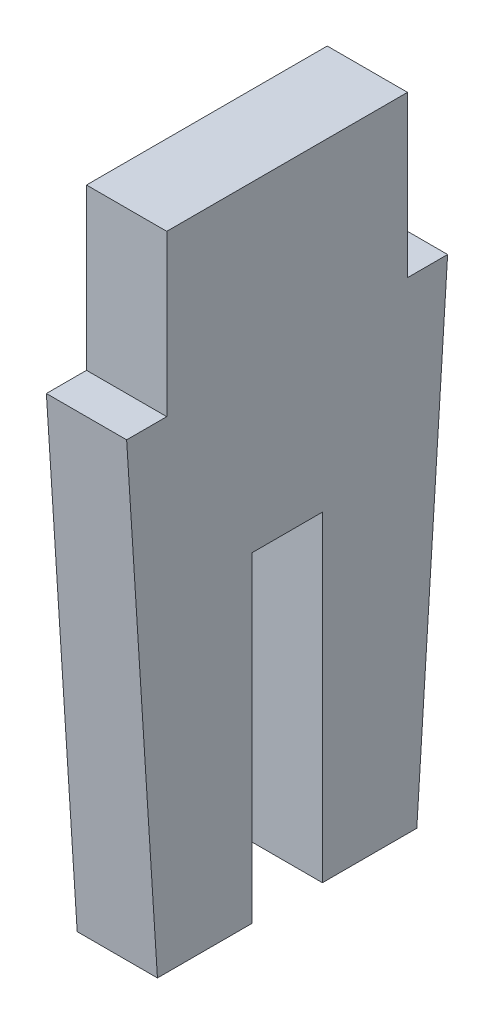
ISO-10303-21;
HEADER;
FILE_DESCRIPTION(('STEP AP214'),'2;1');
FILE_NAME('part.step','',(''),(''),'','','');
FILE_SCHEMA(('AUTOMOTIVE_DESIGN { 1 0 10303 214 1 1 1 1 }'));
ENDSEC;
DATA;
#1=APPLICATION_CONTEXT('core data for automotive mechanical design processes');
#2=APPLICATION_PROTOCOL_DEFINITION('international standard','automotive_design',2000,#1);
#3=PRODUCT_CONTEXT('',#1,'mechanical');
#4=PRODUCT('Part','Part','',(#3));
#5=PRODUCT_RELATED_PRODUCT_CATEGORY('part','',(#4));
#6=PRODUCT_DEFINITION_FORMATION('','',#4);
#7=PRODUCT_DEFINITION_CONTEXT('part definition',#1,'design');
#8=PRODUCT_DEFINITION('design','',#6,#7);
#9=PRODUCT_DEFINITION_SHAPE('','',#8);
#10=(LENGTH_UNIT() NAMED_UNIT(*) SI_UNIT(.MILLI.,.METRE.));
#11=(NAMED_UNIT(*) PLANE_ANGLE_UNIT() SI_UNIT($,.RADIAN.));
#12=(NAMED_UNIT(*) SI_UNIT($,.STERADIAN.) SOLID_ANGLE_UNIT());
#13=UNCERTAINTY_MEASURE_WITH_UNIT(LENGTH_MEASURE(1.E-05),#10,'distance_accuracy_value','');
#14=(GEOMETRIC_REPRESENTATION_CONTEXT(3) GLOBAL_UNCERTAINTY_ASSIGNED_CONTEXT((#13)) GLOBAL_UNIT_ASSIGNED_CONTEXT((#10,
#11,#12)) REPRESENTATION_CONTEXT('',''));
#15=CARTESIAN_POINT('',(0.,0.,0.));
#16=DIRECTION('',(0.,0.,1.));
#17=DIRECTION('',(1.,0.,0.));
#18=AXIS2_PLACEMENT_3D('',#15,#16,#17);
#19=CARTESIAN_POINT('',(6.35,50.8,0.));
#20=DIRECTION('',(0.,0.,-1.));
#21=DIRECTION('',(0.,1.,0.));
#22=AXIS2_PLACEMENT_3D('',#19,#20,#21);
#23=PLANE('',#22);
#24=DIRECTION('',(0.,-1.,0.));
#25=VECTOR('',#24,1.);
#26=CARTESIAN_POINT('',(0.,50.8,0.));
#27=LINE('',#26,#25);
#28=CARTESIAN_POINT('',(0.,50.8,0.));
#29=VERTEX_POINT('',#28);
#30=CARTESIAN_POINT('',(0.,38.1,0.));
#31=VERTEX_POINT('',#30);
#32=EDGE_CURVE('E153',#29,#31,#27,.T.);
#33=ORIENTED_EDGE('',*,*,#32,.T.);
#34=DIRECTION('',(-1.,0.,0.));
#35=VECTOR('',#34,1.);
#36=CARTESIAN_POINT('',(6.35,38.1,0.));
#37=LINE('',#36,#35);
#38=CARTESIAN_POINT('',(6.35,38.1,0.));
#39=VERTEX_POINT('',#38);
#40=EDGE_CURVE('E11',#39,#31,#37,.T.);
#41=ORIENTED_EDGE('',*,*,#40,.F.);
#42=DIRECTION('',(0.,-1.,0.));
#43=VECTOR('',#42,1.);
#44=CARTESIAN_POINT('',(6.35,50.8,0.));
#45=LINE('',#44,#43);
#46=CARTESIAN_POINT('',(6.35,50.8,0.));
#47=VERTEX_POINT('',#46);
#48=EDGE_CURVE('E177',#47,#39,#45,.T.);
#49=ORIENTED_EDGE('',*,*,#48,.F.);
#50=DIRECTION('',(-1.,0.,0.));
#51=VECTOR('',#50,1.);
#52=CARTESIAN_POINT('',(6.35,50.8,0.));
#53=LINE('',#52,#51);
#54=EDGE_CURVE('E149',#47,#29,#53,.T.);
#55=ORIENTED_EDGE('',*,*,#54,.T.);
#56=EDGE_LOOP('',(#33,#41,#49,#55));
#57=FACE_BOUND('',#56,.T.);
#58=ADVANCED_FACE('F33',(#57),#23,.F.);
#59=CARTESIAN_POINT('',(6.35,38.1,0.));
#60=DIRECTION('',(0.,-1.,0.));
#61=DIRECTION('',(0.,0.,-1.));
#62=AXIS2_PLACEMENT_3D('',#59,#60,#61);
#63=PLANE('',#62);
#64=DIRECTION('',(0.,0.,1.));
#65=VECTOR('',#64,1.);
#66=CARTESIAN_POINT('',(0.,38.1,0.));
#67=LINE('',#66,#65);
#68=CARTESIAN_POINT('',(0.,38.1,3.175));
#69=VERTEX_POINT('',#68);
#70=EDGE_CURVE('E156',#31,#69,#67,.T.);
#71=ORIENTED_EDGE('',*,*,#70,.T.);
#72=DIRECTION('',(-1.,0.,0.));
#73=VECTOR('',#72,1.);
#74=CARTESIAN_POINT('',(6.35,38.1,3.175));
#75=LINE('',#74,#73);
#76=CARTESIAN_POINT('',(6.35,38.1,3.175));
#77=VERTEX_POINT('',#76);
#78=EDGE_CURVE('E41',#77,#69,#75,.T.);
#79=ORIENTED_EDGE('',*,*,#78,.F.);
#80=DIRECTION('',(0.,0.,1.));
#81=VECTOR('',#80,1.);
#82=CARTESIAN_POINT('',(6.35,38.1,0.));
#83=LINE('',#82,#81);
#84=EDGE_CURVE('E104',#39,#77,#83,.T.);
#85=ORIENTED_EDGE('',*,*,#84,.F.);
#86=ORIENTED_EDGE('',*,*,#40,.T.);
#87=EDGE_LOOP('',(#71,#79,#85,#86));
#88=FACE_BOUND('',#87,.T.);
#89=ADVANCED_FACE('F204',(#88),#63,.F.);
#90=CARTESIAN_POINT('',(6.35,6.35,1.143));
#91=DIRECTION('',(0.,0.0638693292837024,-0.997958270057847));
#92=DIRECTION('',(0.,0.997958270057847,0.0638693292837024));
#93=AXIS2_PLACEMENT_3D('',#90,#91,#92);
#94=PLANE('',#93);
#95=DIRECTION('',(0.,-0.997958270057847,-0.0638693292837024));
#96=VECTOR('',#95,1.);
#97=CARTESIAN_POINT('',(0.,6.35,1.143));
#98=LINE('',#97,#96);
#99=CARTESIAN_POINT('',(0.,0.,0.736599999999994));
#100=VERTEX_POINT('',#99);
#101=EDGE_CURVE('E159',#69,#100,#98,.T.);
#102=ORIENTED_EDGE('',*,*,#101,.T.);
#103=DIRECTION('',(-1.,0.,0.));
#104=VECTOR('',#103,1.);
#105=CARTESIAN_POINT('',(6.35,0.,0.736599999999994));
#106=LINE('',#105,#104);
#107=CARTESIAN_POINT('',(6.35,0.,0.736599999999994));
#108=VERTEX_POINT('',#107);
#109=EDGE_CURVE('E196',#108,#100,#106,.T.);
#110=ORIENTED_EDGE('',*,*,#109,.F.);
#111=DIRECTION('',(0.,-0.997958270057847,-0.0638693292837023));
#112=VECTOR('',#111,1.);
#113=CARTESIAN_POINT('',(6.35,38.1,3.175));
#114=LINE('',#113,#112);
#115=EDGE_CURVE('E203',#77,#108,#114,.T.);
#116=ORIENTED_EDGE('',*,*,#115,.F.);
#117=ORIENTED_EDGE('',*,*,#78,.T.);
#118=EDGE_LOOP('',(#102,#110,#116,#117));
#119=FACE_BOUND('',#118,.T.);
#120=ADVANCED_FACE('F201',(#119),#94,.F.);
#121=CARTESIAN_POINT('',(6.35,0.,0.736599999999994));
#122=DIRECTION('',(0.,1.,0.));
#123=DIRECTION('',(0.,0.,1.));
#124=AXIS2_PLACEMENT_3D('',#121,#122,#123);
#125=PLANE('',#124);
#126=DIRECTION('',(0.,0.,-1.));
#127=VECTOR('',#126,1.);
#128=CARTESIAN_POINT('',(0.,0.,0.736599999999994));
#129=LINE('',#128,#127);
#130=CARTESIAN_POINT('',(0.,0.,-6.731));
#131=VERTEX_POINT('',#130);
#132=EDGE_CURVE('E161',#100,#131,#129,.T.);
#133=ORIENTED_EDGE('',*,*,#132,.T.);
#134=DIRECTION('',(-1.,0.,0.));
#135=VECTOR('',#134,1.);
#136=CARTESIAN_POINT('',(6.35,0.,-6.731));
#137=LINE('',#136,#135);
#138=CARTESIAN_POINT('',(6.35,0.,-6.731));
#139=VERTEX_POINT('',#138);
#140=EDGE_CURVE('E193',#139,#131,#137,.T.);
#141=ORIENTED_EDGE('',*,*,#140,.F.);
#142=DIRECTION('',(0.,0.,-1.));
#143=VECTOR('',#142,1.);
#144=CARTESIAN_POINT('',(6.35,0.,0.736599999999994));
#145=LINE('',#144,#143);
#146=EDGE_CURVE('E223',#108,#139,#145,.T.);
#147=ORIENTED_EDGE('',*,*,#146,.F.);
#148=ORIENTED_EDGE('',*,*,#109,.T.);
#149=EDGE_LOOP('',(#133,#141,#147,#148));
#150=FACE_BOUND('',#149,.T.);
#151=ADVANCED_FACE('F214',(#150),#125,.F.);
#152=CARTESIAN_POINT('',(6.35,25.4,-6.731));
#153=DIRECTION('',(0.,0.,1.));
#154=DIRECTION('',(0.,-1.,0.));
#155=AXIS2_PLACEMENT_3D('',#152,#153,#154);
#156=PLANE('',#155);
#157=DIRECTION('',(0.,1.,0.));
#158=VECTOR('',#157,1.);
#159=CARTESIAN_POINT('',(0.,25.4,-6.731));
#160=LINE('',#159,#158);
#161=CARTESIAN_POINT('',(0.,25.4,-6.731));
#162=VERTEX_POINT('',#161);
#163=EDGE_CURVE('E163',#131,#162,#160,.T.);
#164=ORIENTED_EDGE('',*,*,#163,.T.);
#165=DIRECTION('',(-1.,0.,0.));
#166=VECTOR('',#165,1.);
#167=CARTESIAN_POINT('',(6.35,25.4,-6.731));
#168=LINE('',#167,#166);
#169=CARTESIAN_POINT('',(6.35,25.4,-6.731));
#170=VERTEX_POINT('',#169);
#171=EDGE_CURVE('E190',#170,#162,#168,.T.);
#172=ORIENTED_EDGE('',*,*,#171,.F.);
#173=DIRECTION('',(0.,1.,0.));
#174=VECTOR('',#173,1.);
#175=CARTESIAN_POINT('',(6.35,25.4,-6.731));
#176=LINE('',#175,#174);
#177=EDGE_CURVE('E220',#139,#170,#176,.T.);
#178=ORIENTED_EDGE('',*,*,#177,.F.);
#179=ORIENTED_EDGE('',*,*,#140,.T.);
#180=EDGE_LOOP('',(#164,#172,#178,#179));
#181=FACE_BOUND('',#180,.T.);
#182=ADVANCED_FACE('F218',(#181),#156,.F.);
#183=CARTESIAN_POINT('',(6.35,25.4,-12.319));
#184=DIRECTION('',(0.,1.,0.));
#185=DIRECTION('',(0.,0.,1.));
#186=AXIS2_PLACEMENT_3D('',#183,#184,#185);
#187=PLANE('',#186);
#188=DIRECTION('',(0.,0.,-1.));
#189=VECTOR('',#188,1.);
#190=CARTESIAN_POINT('',(0.,25.4,-12.319));
#191=LINE('',#190,#189);
#192=CARTESIAN_POINT('',(0.,25.4,-12.319));
#193=VERTEX_POINT('',#192);
#194=EDGE_CURVE('E165',#162,#193,#191,.T.);
#195=ORIENTED_EDGE('',*,*,#194,.T.);
#196=DIRECTION('',(-1.,0.,0.));
#197=VECTOR('',#196,1.);
#198=CARTESIAN_POINT('',(6.35,25.4,-12.319));
#199=LINE('',#198,#197);
#200=CARTESIAN_POINT('',(6.35,25.4,-12.319));
#201=VERTEX_POINT('',#200);
#202=EDGE_CURVE('E187',#201,#193,#199,.T.);
#203=ORIENTED_EDGE('',*,*,#202,.F.);
#204=DIRECTION('',(0.,0.,-1.));
#205=VECTOR('',#204,1.);
#206=CARTESIAN_POINT('',(6.35,25.4,-12.319));
#207=LINE('',#206,#205);
#208=EDGE_CURVE('E222',#170,#201,#207,.T.);
#209=ORIENTED_EDGE('',*,*,#208,.F.);
#210=ORIENTED_EDGE('',*,*,#171,.T.);
#211=EDGE_LOOP('',(#195,#203,#209,#210));
#212=FACE_BOUND('',#211,.T.);
#213=ADVANCED_FACE('F246',(#212),#187,.F.);
#214=CARTESIAN_POINT('',(6.35,25.4,-12.319));
#215=DIRECTION('',(0.,0.,-1.));
#216=DIRECTION('',(0.,1.,0.));
#217=AXIS2_PLACEMENT_3D('',#214,#215,#216);
#218=PLANE('',#217);
#219=DIRECTION('',(0.,-1.,0.));
#220=VECTOR('',#219,1.);
#221=CARTESIAN_POINT('',(0.,25.4,-12.319));
#222=LINE('',#221,#220);
#223=CARTESIAN_POINT('',(0.,0.,-12.319));
#224=VERTEX_POINT('',#223);
#225=EDGE_CURVE('E167',#193,#224,#222,.T.);
#226=ORIENTED_EDGE('',*,*,#225,.T.);
#227=DIRECTION('',(-1.,0.,0.));
#228=VECTOR('',#227,1.);
#229=CARTESIAN_POINT('',(6.35,0.,-12.319));
#230=LINE('',#229,#228);
#231=CARTESIAN_POINT('',(6.35,0.,-12.319));
#232=VERTEX_POINT('',#231);
#233=EDGE_CURVE('E184',#232,#224,#230,.T.);
#234=ORIENTED_EDGE('',*,*,#233,.F.);
#235=DIRECTION('',(0.,-1.,0.));
#236=VECTOR('',#235,1.);
#237=CARTESIAN_POINT('',(6.35,25.4,-12.319));
#238=LINE('',#237,#236);
#239=EDGE_CURVE('E225',#201,#232,#238,.T.);
#240=ORIENTED_EDGE('',*,*,#239,.F.);
#241=ORIENTED_EDGE('',*,*,#202,.T.);
#242=EDGE_LOOP('',(#226,#234,#240,#241));
#243=FACE_BOUND('',#242,.T.);
#244=ADVANCED_FACE('F243',(#243),#218,.F.);
#245=CARTESIAN_POINT('',(6.35,0.,-12.319));
#246=DIRECTION('',(0.,1.,0.));
#247=DIRECTION('',(0.,0.,1.));
#248=AXIS2_PLACEMENT_3D('',#245,#246,#247);
#249=PLANE('',#248);
#250=DIRECTION('',(0.,0.,-1.));
#251=VECTOR('',#250,1.);
#252=CARTESIAN_POINT('',(0.,0.,-12.319));
#253=LINE('',#252,#251);
#254=CARTESIAN_POINT('',(0.,0.,-19.7866));
#255=VERTEX_POINT('',#254);
#256=EDGE_CURVE('E169',#224,#255,#253,.T.);
#257=ORIENTED_EDGE('',*,*,#256,.T.);
#258=DIRECTION('',(-1.,0.,0.));
#259=VECTOR('',#258,1.);
#260=CARTESIAN_POINT('',(6.35,0.,-19.7866));
#261=LINE('',#260,#259);
#262=CARTESIAN_POINT('',(6.35,0.,-19.7866));
#263=VERTEX_POINT('',#262);
#264=EDGE_CURVE('E181',#263,#255,#261,.T.);
#265=ORIENTED_EDGE('',*,*,#264,.F.);
#266=DIRECTION('',(0.,0.,-1.));
#267=VECTOR('',#266,1.);
#268=CARTESIAN_POINT('',(6.35,0.,-12.319));
#269=LINE('',#268,#267);
#270=EDGE_CURVE('E231',#232,#263,#269,.T.);
#271=ORIENTED_EDGE('',*,*,#270,.F.);
#272=ORIENTED_EDGE('',*,*,#233,.T.);
#273=EDGE_LOOP('',(#257,#265,#271,#272));
#274=FACE_BOUND('',#273,.T.);
#275=ADVANCED_FACE('F237',(#274),#249,.F.);
#276=CARTESIAN_POINT('',(6.35,38.1,-22.225));
#277=DIRECTION('',(0.,0.0638693292837021,0.997958270057847));
#278=DIRECTION('',(0.,-0.997958270057847,0.0638693292837021));
#279=AXIS2_PLACEMENT_3D('',#276,#277,#278);
#280=PLANE('',#279);
#281=DIRECTION('',(0.,0.997958270057847,-0.0638693292837021));
#282=VECTOR('',#281,1.);
#283=CARTESIAN_POINT('',(0.,38.1,-22.225));
#284=LINE('',#283,#282);
#285=CARTESIAN_POINT('',(0.,38.1,-22.225));
#286=VERTEX_POINT('',#285);
#287=EDGE_CURVE('E172',#255,#286,#284,.T.);
#288=ORIENTED_EDGE('',*,*,#287,.T.);
#289=DIRECTION('',(-1.,0.,0.));
#290=VECTOR('',#289,1.);
#291=CARTESIAN_POINT('',(6.35,38.1,-22.225));
#292=LINE('',#291,#290);
#293=CARTESIAN_POINT('',(6.35,38.1,-22.225));
#294=VERTEX_POINT('',#293);
#295=EDGE_CURVE('E144',#294,#286,#292,.T.);
#296=ORIENTED_EDGE('',*,*,#295,.F.);
#297=DIRECTION('',(0.,0.997958270057847,-0.0638693292837024));
#298=VECTOR('',#297,1.);
#299=CARTESIAN_POINT('',(6.35,6.35,-20.193));
#300=LINE('',#299,#298);
#301=EDGE_CURVE('E135',#263,#294,#300,.T.);
#302=ORIENTED_EDGE('',*,*,#301,.F.);
#303=ORIENTED_EDGE('',*,*,#264,.T.);
#304=EDGE_LOOP('',(#288,#296,#302,#303));
#305=FACE_BOUND('',#304,.T.);
#306=ADVANCED_FACE('F240',(#305),#280,.F.);
#307=CARTESIAN_POINT('',(6.35,38.1,-19.05));
#308=DIRECTION('',(0.,-1.,0.));
#309=DIRECTION('',(0.,0.,-1.));
#310=AXIS2_PLACEMENT_3D('',#307,#308,#309);
#311=PLANE('',#310);
#312=DIRECTION('',(0.,0.,1.));
#313=VECTOR('',#312,1.);
#314=CARTESIAN_POINT('',(0.,38.1,-19.05));
#315=LINE('',#314,#313);
#316=CARTESIAN_POINT('',(0.,38.1,-19.05));
#317=VERTEX_POINT('',#316);
#318=EDGE_CURVE('E143',#286,#317,#315,.T.);
#319=ORIENTED_EDGE('',*,*,#318,.T.);
#320=DIRECTION('',(-1.,0.,0.));
#321=VECTOR('',#320,1.);
#322=CARTESIAN_POINT('',(6.35,38.1,-19.05));
#323=LINE('',#322,#321);
#324=CARTESIAN_POINT('',(6.35,38.1,-19.05));
#325=VERTEX_POINT('',#324);
#326=EDGE_CURVE('E140',#325,#317,#323,.T.);
#327=ORIENTED_EDGE('',*,*,#326,.F.);
#328=DIRECTION('',(0.,0.,1.));
#329=VECTOR('',#328,1.);
#330=CARTESIAN_POINT('',(6.35,38.1,-19.05));
#331=LINE('',#330,#329);
#332=EDGE_CURVE('E129',#294,#325,#331,.T.);
#333=ORIENTED_EDGE('',*,*,#332,.F.);
#334=ORIENTED_EDGE('',*,*,#295,.T.);
#335=EDGE_LOOP('',(#319,#327,#333,#334));
#336=FACE_BOUND('',#335,.T.);
#337=ADVANCED_FACE('F141',(#336),#311,.F.);
#338=CARTESIAN_POINT('',(6.35,50.8,-19.05));
#339=DIRECTION('',(0.,0.,1.));
#340=DIRECTION('',(0.,-1.,0.));
#341=AXIS2_PLACEMENT_3D('',#338,#339,#340);
#342=PLANE('',#341);
#343=DIRECTION('',(0.,1.,0.));
#344=VECTOR('',#343,1.);
#345=CARTESIAN_POINT('',(0.,50.8,-19.05));
#346=LINE('',#345,#344);
#347=CARTESIAN_POINT('',(0.,50.8,-19.05));
#348=VERTEX_POINT('',#347);
#349=EDGE_CURVE('E90',#317,#348,#346,.T.);
#350=ORIENTED_EDGE('',*,*,#349,.T.);
#351=DIRECTION('',(-1.,0.,0.));
#352=VECTOR('',#351,1.);
#353=CARTESIAN_POINT('',(6.35,50.8,-19.05));
#354=LINE('',#353,#352);
#355=CARTESIAN_POINT('',(6.35,50.8,-19.05));
#356=VERTEX_POINT('',#355);
#357=EDGE_CURVE('E145',#356,#348,#354,.T.);
#358=ORIENTED_EDGE('',*,*,#357,.F.);
#359=DIRECTION('',(0.,1.,0.));
#360=VECTOR('',#359,1.);
#361=CARTESIAN_POINT('',(6.35,50.8,-19.05));
#362=LINE('',#361,#360);
#363=EDGE_CURVE('E133',#325,#356,#362,.T.);
#364=ORIENTED_EDGE('',*,*,#363,.F.);
#365=ORIENTED_EDGE('',*,*,#326,.T.);
#366=EDGE_LOOP('',(#350,#358,#364,#365));
#367=FACE_BOUND('',#366,.T.);
#368=ADVANCED_FACE('F147',(#367),#342,.F.);
#369=CARTESIAN_POINT('',(6.35,50.8,0.));
#370=DIRECTION('',(0.,-1.,0.));
#371=DIRECTION('',(0.,0.,-1.));
#372=AXIS2_PLACEMENT_3D('',#369,#370,#371);
#373=PLANE('',#372);
#374=DIRECTION('',(0.,0.,1.));
#375=VECTOR('',#374,1.);
#376=CARTESIAN_POINT('',(0.,50.8,0.));
#377=LINE('',#376,#375);
#378=EDGE_CURVE('E96',#348,#29,#377,.T.);
#379=ORIENTED_EDGE('',*,*,#378,.T.);
#380=ORIENTED_EDGE('',*,*,#54,.F.);
#381=DIRECTION('',(0.,0.,1.));
#382=VECTOR('',#381,1.);
#383=CARTESIAN_POINT('',(6.35,50.8,0.));
#384=LINE('',#383,#382);
#385=EDGE_CURVE('E49',#356,#47,#384,.T.);
#386=ORIENTED_EDGE('',*,*,#385,.F.);
#387=ORIENTED_EDGE('',*,*,#357,.T.);
#388=EDGE_LOOP('',(#379,#380,#386,#387));
#389=FACE_BOUND('',#388,.T.);
#390=ADVANCED_FACE('F261',(#389),#373,.F.);
#391=CARTESIAN_POINT('',(6.35,0.,0.));
#392=DIRECTION('',(-1.,0.,0.));
#393=DIRECTION('',(0.,0.,1.));
#394=AXIS2_PLACEMENT_3D('',#391,#392,#393);
#395=PLANE('',#394);
#396=ORIENTED_EDGE('',*,*,#48,.T.);
#397=ORIENTED_EDGE('',*,*,#84,.T.);
#398=ORIENTED_EDGE('',*,*,#115,.T.);
#399=ORIENTED_EDGE('',*,*,#146,.T.);
#400=ORIENTED_EDGE('',*,*,#177,.T.);
#401=ORIENTED_EDGE('',*,*,#208,.T.);
#402=ORIENTED_EDGE('',*,*,#239,.T.);
#403=ORIENTED_EDGE('',*,*,#270,.T.);
#404=ORIENTED_EDGE('',*,*,#301,.T.);
#405=ORIENTED_EDGE('',*,*,#332,.T.);
#406=ORIENTED_EDGE('',*,*,#363,.T.);
#407=ORIENTED_EDGE('',*,*,#385,.T.);
#408=EDGE_LOOP('',(#396,#397,#398,#399,#400,#401,#402,#403,#404,#405,#406,#407));
#409=FACE_BOUND('',#408,.T.);
#410=ADVANCED_FACE('F131',(#409),#395,.F.);
#411=CARTESIAN_POINT('',(0.,0.,0.));
#412=DIRECTION('',(-1.,0.,0.));
#413=DIRECTION('',(0.,0.,1.));
#414=AXIS2_PLACEMENT_3D('',#411,#412,#413);
#415=PLANE('',#414);
#416=ORIENTED_EDGE('',*,*,#32,.F.);
#417=ORIENTED_EDGE('',*,*,#378,.F.);
#418=ORIENTED_EDGE('',*,*,#349,.F.);
#419=ORIENTED_EDGE('',*,*,#318,.F.);
#420=ORIENTED_EDGE('',*,*,#287,.F.);
#421=ORIENTED_EDGE('',*,*,#256,.F.);
#422=ORIENTED_EDGE('',*,*,#225,.F.);
#423=ORIENTED_EDGE('',*,*,#194,.F.);
#424=ORIENTED_EDGE('',*,*,#163,.F.);
#425=ORIENTED_EDGE('',*,*,#132,.F.);
#426=ORIENTED_EDGE('',*,*,#101,.F.);
#427=ORIENTED_EDGE('',*,*,#70,.F.);
#428=EDGE_LOOP('',(#416,#417,#418,#419,#420,#421,#422,#423,#424,#425,#426,#427));
#429=FACE_BOUND('',#428,.T.);
#430=ADVANCED_FACE('F208',(#429),#415,.T.);
#431=CLOSED_SHELL('',(#58,#89,#120,#151,#182,#213,#244,#275,#306,#337,#368,#390,#410,#430));
#432=MANIFOLD_SOLID_BREP('B2',#431);
#433=ADVANCED_BREP_SHAPE_REPRESENTATION('',(#18,#432),#14);
#434=SHAPE_DEFINITION_REPRESENTATION(#9,#433);
ENDSEC;
END-ISO-10303-21;
